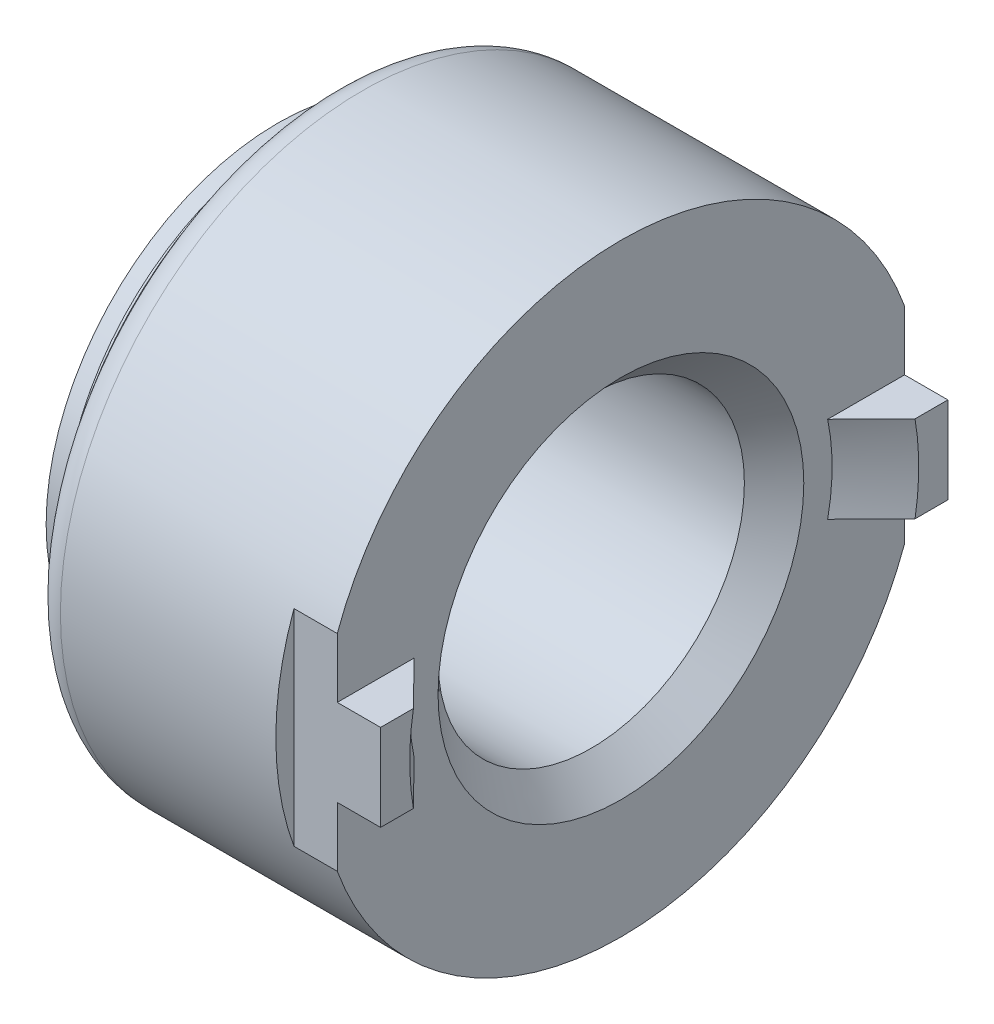
ISO-10303-21;
HEADER;
FILE_DESCRIPTION(('STEP AP214'),'2;1');
FILE_NAME('part.step','',(''),(''),'','','');
FILE_SCHEMA(('AUTOMOTIVE_DESIGN { 1 0 10303 214 1 1 1 1 }'));
ENDSEC;
DATA;
#1=APPLICATION_CONTEXT('core data for automotive mechanical design processes');
#2=APPLICATION_PROTOCOL_DEFINITION('international standard','automotive_design',2000,#1);
#3=PRODUCT_CONTEXT('',#1,'mechanical');
#4=PRODUCT('Part','Part','',(#3));
#5=PRODUCT_RELATED_PRODUCT_CATEGORY('part','',(#4));
#6=PRODUCT_DEFINITION_FORMATION('','',#4);
#7=PRODUCT_DEFINITION_CONTEXT('part definition',#1,'design');
#8=PRODUCT_DEFINITION('design','',#6,#7);
#9=PRODUCT_DEFINITION_SHAPE('','',#8);
#10=(LENGTH_UNIT() NAMED_UNIT(*) SI_UNIT(.MILLI.,.METRE.));
#11=(NAMED_UNIT(*) PLANE_ANGLE_UNIT() SI_UNIT($,.RADIAN.));
#12=(NAMED_UNIT(*) SI_UNIT($,.STERADIAN.) SOLID_ANGLE_UNIT());
#13=UNCERTAINTY_MEASURE_WITH_UNIT(LENGTH_MEASURE(1.E-05),#10,'distance_accuracy_value','');
#14=(GEOMETRIC_REPRESENTATION_CONTEXT(3) GLOBAL_UNCERTAINTY_ASSIGNED_CONTEXT((#13)) GLOBAL_UNIT_ASSIGNED_CONTEXT((#10,
#11,#12)) REPRESENTATION_CONTEXT('',''));
#15=CARTESIAN_POINT('',(0.,0.,0.));
#16=DIRECTION('',(0.,0.,1.));
#17=DIRECTION('',(1.,0.,0.));
#18=AXIS2_PLACEMENT_3D('',#15,#16,#17);
#19=CARTESIAN_POINT('',(9.38000000000008,0.,0.));
#20=DIRECTION('',(1.,0.,0.));
#21=DIRECTION('',(0.,0.,-1.));
#22=AXIS2_PLACEMENT_3D('',#19,#20,#21);
#23=PLANE('',#22);
#24=CARTESIAN_POINT('',(9.38000000000008,0.,0.));
#25=DIRECTION('',(1.,0.,0.));
#26=DIRECTION('',(0.,0.,-1.));
#27=AXIS2_PLACEMENT_3D('',#24,#25,#26);
#28=CIRCLE('',#27,5.00000000005311);
#29=CARTESIAN_POINT('',(9.38000000000008,0.,-5.00000000005311));
#30=VERTEX_POINT('',#29);
#31=EDGE_CURVE('E219',#30,#30,#28,.F.);
#32=ORIENTED_EDGE('',*,*,#31,.T.);
#33=EDGE_LOOP('',(#32));
#34=FACE_BOUND('',#33,.T.);
#35=DIRECTION('',(0.,1.,0.));
#36=VECTOR('',#35,1.);
#37=CARTESIAN_POINT('',(9.38000000000008,-2.81468914802327,-7.75500000000001));
#38=LINE('',#37,#36);
#39=CARTESIAN_POINT('',(9.38000000000008,1.18400000000002,-7.75500000000001));
#40=VERTEX_POINT('',#39);
#41=CARTESIAN_POINT('',(9.38000000000008,2.81468914802327,-7.75500000000001));
#42=VERTEX_POINT('',#41);
#43=EDGE_CURVE('E80',#40,#42,#38,.T.);
#44=ORIENTED_EDGE('',*,*,#43,.T.);
#45=CARTESIAN_POINT('',(9.38000000000008,0.,0.));
#46=DIRECTION('',(1.,0.,0.));
#47=DIRECTION('',(0.,0.,-1.));
#48=AXIS2_PLACEMENT_3D('',#45,#46,#47);
#49=CIRCLE('',#48,8.25);
#50=CARTESIAN_POINT('',(9.38000000000008,2.81468914802319,7.75500000000001));
#51=VERTEX_POINT('',#50);
#52=EDGE_CURVE('E150',#42,#51,#49,.T.);
#53=ORIENTED_EDGE('',*,*,#52,.T.);
#54=DIRECTION('',(0.,-1.,0.));
#55=VECTOR('',#54,1.);
#56=CARTESIAN_POINT('',(9.38000000000008,2.81468914802319,7.75500000000001));
#57=LINE('',#56,#55);
#58=CARTESIAN_POINT('',(9.38000000000008,1.18399999999999,7.75500000000001));
#59=VERTEX_POINT('',#58);
#60=EDGE_CURVE('E257',#51,#59,#57,.T.);
#61=ORIENTED_EDGE('',*,*,#60,.T.);
#62=DIRECTION('',(0.,0.,1.));
#63=VECTOR('',#62,1.);
#64=CARTESIAN_POINT('',(9.38000000000008,1.18399999999999,7.75500000000001));
#65=LINE('',#64,#63);
#66=CARTESIAN_POINT('',(9.38000000000008,1.18399999999991,5.65232421218825));
#67=VERTEX_POINT('',#66);
#68=EDGE_CURVE('E126',#67,#59,#65,.T.);
#69=ORIENTED_EDGE('',*,*,#68,.F.);
#70=CARTESIAN_POINT('',(9.38000000000008,0.,0.));
#71=DIRECTION('',(-1.,0.,0.));
#72=DIRECTION('',(0.,0.,-1.));
#73=AXIS2_PLACEMENT_3D('',#70,#71,#72);
#74=CIRCLE('',#73,5.77499999997313);
#75=CARTESIAN_POINT('',(9.38000000000008,-1.18400000000007,5.65232421218825));
#76=VERTEX_POINT('',#75);
#77=EDGE_CURVE('E130',#76,#67,#74,.T.);
#78=ORIENTED_EDGE('',*,*,#77,.F.);
#79=DIRECTION('',(0.,0.,-1.));
#80=VECTOR('',#79,1.);
#81=CARTESIAN_POINT('',(9.38000000000008,-1.18400000000007,5.65232421218825));
#82=LINE('',#81,#80);
#83=CARTESIAN_POINT('',(9.38000000000008,-1.18399999999999,7.75500000000001));
#84=VERTEX_POINT('',#83);
#85=EDGE_CURVE('E116',#84,#76,#82,.T.);
#86=ORIENTED_EDGE('',*,*,#85,.F.);
#87=CARTESIAN_POINT('',(9.38000000000008,-2.8146891480233,7.75500000000001));
#88=VERTEX_POINT('',#87);
#89=EDGE_CURVE('E51',#84,#88,#57,.T.);
#90=ORIENTED_EDGE('',*,*,#89,.T.);
#91=CARTESIAN_POINT('',(9.38000000000008,-2.81468914802327,-7.75500000000001));
#92=VERTEX_POINT('',#91);
#93=EDGE_CURVE('E147',#88,#92,#49,.T.);
#94=ORIENTED_EDGE('',*,*,#93,.T.);
#95=CARTESIAN_POINT('',(9.38000000000008,-1.18399999999999,-7.75500000000001));
#96=VERTEX_POINT('',#95);
#97=EDGE_CURVE('E292',#92,#96,#38,.T.);
#98=ORIENTED_EDGE('',*,*,#97,.T.);
#99=DIRECTION('',(0.,0.,-1.));
#100=VECTOR('',#99,1.);
#101=CARTESIAN_POINT('',(9.38000000000008,-1.18399999999999,-7.75500000000001));
#102=LINE('',#101,#100);
#103=CARTESIAN_POINT('',(9.38000000000008,-1.18400000000007,-5.65232421218825));
#104=VERTEX_POINT('',#103);
#105=EDGE_CURVE('E298',#104,#96,#102,.T.);
#106=ORIENTED_EDGE('',*,*,#105,.F.);
#107=CARTESIAN_POINT('',(9.38000000000008,0.,0.));
#108=DIRECTION('',(-1.,0.,0.));
#109=DIRECTION('',(0.,0.,-1.));
#110=AXIS2_PLACEMENT_3D('',#107,#108,#109);
#111=CIRCLE('',#110,5.77499999997313);
#112=CARTESIAN_POINT('',(9.38000000000008,1.18399999999999,-5.65232421218825));
#113=VERTEX_POINT('',#112);
#114=EDGE_CURVE('E290',#113,#104,#111,.T.);
#115=ORIENTED_EDGE('',*,*,#114,.F.);
#116=DIRECTION('',(0.,0.,1.));
#117=VECTOR('',#116,1.);
#118=CARTESIAN_POINT('',(9.38000000000008,1.18400000000002,-5.65232421218825));
#119=LINE('',#118,#117);
#120=EDGE_CURVE('E286',#40,#113,#119,.T.);
#121=ORIENTED_EDGE('',*,*,#120,.F.);
#122=EDGE_LOOP('',(#44,#53,#61,#69,#78,#86,#90,#94,#98,#106,#115,#121));
#123=FACE_BOUND('',#122,.T.);
#124=ADVANCED_FACE('F34',(#34,#123),#23,.T.);
#125=CARTESIAN_POINT('',(1.48000000000001,0.,0.));
#126=DIRECTION('',(1.,0.,0.));
#127=DIRECTION('',(0.,0.,-1.));
#128=AXIS2_PLACEMENT_3D('',#125,#126,#127);
#129=CYLINDRICAL_SURFACE('',#128,8.25);
#130=CARTESIAN_POINT('',(2.305,0.,0.));
#131=DIRECTION('',(-1.,0.,0.));
#132=DIRECTION('',(0.,0.,1.));
#133=AXIS2_PLACEMENT_3D('',#130,#131,#132);
#134=CIRCLE('',#133,8.25);
#135=CARTESIAN_POINT('',(2.305,0.,8.25));
#136=VERTEX_POINT('',#135);
#137=EDGE_CURVE('E43',#136,#136,#134,.F.);
#138=ORIENTED_EDGE('',*,*,#137,.T.);
#139=EDGE_LOOP('',(#138));
#140=FACE_BOUND('',#139,.T.);
#141=DIRECTION('',(-1.,0.,0.));
#142=VECTOR('',#141,1.);
#143=CARTESIAN_POINT('',(15.0310994505495,-2.81468914802327,-7.75500000000001));
#144=LINE('',#143,#142);
#145=CARTESIAN_POINT('',(8.19500000000009,-2.81468914802327,-7.75500000000001));
#146=VERTEX_POINT('',#145);
#147=EDGE_CURVE('E278',#92,#146,#144,.T.);
#148=ORIENTED_EDGE('',*,*,#147,.F.);
#149=ORIENTED_EDGE('',*,*,#93,.F.);
#150=DIRECTION('',(-1.,0.,0.));
#151=VECTOR('',#150,1.);
#152=CARTESIAN_POINT('',(15.0310994505495,-2.8146891480233,7.75500000000001));
#153=LINE('',#152,#151);
#154=CARTESIAN_POINT('',(8.19500000000001,-2.8146891480233,7.75500000000001));
#155=VERTEX_POINT('',#154);
#156=EDGE_CURVE('E138',#88,#155,#153,.T.);
#157=ORIENTED_EDGE('',*,*,#156,.T.);
#158=CARTESIAN_POINT('',(8.19500000000001,0.,0.));
#159=DIRECTION('',(-1.,0.,0.));
#160=DIRECTION('',(0.,0.,1.));
#161=AXIS2_PLACEMENT_3D('',#158,#159,#160);
#162=CIRCLE('',#161,8.25);
#163=CARTESIAN_POINT('',(8.19500000000001,2.81468914802319,7.75500000000001));
#164=VERTEX_POINT('',#163);
#165=EDGE_CURVE('E188',#155,#164,#162,.T.);
#166=ORIENTED_EDGE('',*,*,#165,.T.);
#167=DIRECTION('',(-1.,0.,0.));
#168=VECTOR('',#167,1.);
#169=CARTESIAN_POINT('',(15.0310994505495,2.81468914802319,7.75500000000001));
#170=LINE('',#169,#168);
#171=EDGE_CURVE('E135',#51,#164,#170,.T.);
#172=ORIENTED_EDGE('',*,*,#171,.F.);
#173=ORIENTED_EDGE('',*,*,#52,.F.);
#174=DIRECTION('',(-1.,0.,0.));
#175=VECTOR('',#174,1.);
#176=CARTESIAN_POINT('',(15.0310994505495,2.81468914802327,-7.75500000000001));
#177=LINE('',#176,#175);
#178=CARTESIAN_POINT('',(8.19500000000009,2.81468914802327,-7.75500000000001));
#179=VERTEX_POINT('',#178);
#180=EDGE_CURVE('E287',#42,#179,#177,.T.);
#181=ORIENTED_EDGE('',*,*,#180,.T.);
#182=CARTESIAN_POINT('',(8.19500000000001,0.,0.));
#183=DIRECTION('',(-1.,0.,0.));
#184=DIRECTION('',(0.,0.,1.));
#185=AXIS2_PLACEMENT_3D('',#182,#183,#184);
#186=CIRCLE('',#185,8.25);
#187=EDGE_CURVE('E281',#179,#146,#186,.T.);
#188=ORIENTED_EDGE('',*,*,#187,.T.);
#189=EDGE_LOOP('',(#148,#149,#157,#166,#172,#173,#181,#188));
#190=FACE_BOUND('',#189,.T.);
#191=ADVANCED_FACE('F210',(#140,#190),#129,.T.);
#192=CARTESIAN_POINT('',(1.48000000000001,8.25000000000001,0.));
#193=DIRECTION('',(-1.,0.,0.));
#194=DIRECTION('',(0.,0.,1.));
#195=AXIS2_PLACEMENT_3D('',#192,#193,#194);
#196=PLANE('',#195);
#197=CARTESIAN_POINT('',(1.48000000000001,0.,0.));
#198=DIRECTION('',(-1.,0.,0.));
#199=DIRECTION('',(0.,0.,1.));
#200=AXIS2_PLACEMENT_3D('',#197,#198,#199);
#201=CIRCLE('',#200,7.425);
#202=CARTESIAN_POINT('',(1.48000000000001,0.,7.425));
#203=VERTEX_POINT('',#202);
#204=EDGE_CURVE('E11',#203,#203,#201,.T.);
#205=ORIENTED_EDGE('',*,*,#204,.T.);
#206=EDGE_LOOP('',(#205));
#207=FACE_BOUND('',#206,.T.);
#208=CARTESIAN_POINT('',(1.48000000000001,0.,0.));
#209=DIRECTION('',(-1.,0.,0.));
#210=DIRECTION('',(0.,0.,1.));
#211=AXIS2_PLACEMENT_3D('',#208,#209,#210);
#212=CIRCLE('',#211,7.2925);
#213=CARTESIAN_POINT('',(1.48000000000001,0.,-7.2925));
#214=VERTEX_POINT('',#213);
#215=EDGE_CURVE('E312',#214,#214,#212,.T.);
#216=ORIENTED_EDGE('',*,*,#215,.F.);
#217=EDGE_LOOP('',(#216));
#218=FACE_BOUND('',#217,.T.);
#219=ADVANCED_FACE('F215',(#207,#218),#196,.T.);
#220=CARTESIAN_POINT('',(9.38000000000008,0.,0.));
#221=DIRECTION('',(1.,0.,0.));
#222=DIRECTION('',(0.,0.,-1.));
#223=AXIS2_PLACEMENT_3D('',#220,#221,#222);
#224=CONICAL_SURFACE('',#223,5.77499999997313,0.785398163373447);
#225=ORIENTED_EDGE('',*,*,#77,.T.);
#226=CARTESIAN_POINT('',(10.5640000000001,1.18399999999991,6.85753782336163));
#227=CARTESIAN_POINT('',(10.4651794670113,1.18399999999996,6.75725460929455));
#228=CARTESIAN_POINT('',(10.3663902061018,1.18399999999998,6.65694056545883));
#229=CARTESIAN_POINT('',(10.1688846489795,1.184,6.45624081663868));
#230=CARTESIAN_POINT('',(10.070168352715,1.18399999999999,6.35585511170503));
#231=CARTESIAN_POINT('',(9.87281898757948,1.18399999999999,6.15500187890615));
#232=CARTESIAN_POINT('',(9.77418591872361,1.184,6.05453435102608));
#233=CARTESIAN_POINT('',(9.57701675832027,1.18399999999998,5.85350404507877));
#234=CARTESIAN_POINT('',(9.4784806668416,1.18399999999996,5.75294126694403));
#235=CARTESIAN_POINT('',(9.38000000000008,1.18399999999991,5.65232421218825));
#236=B_SPLINE_CURVE_WITH_KNOTS('',3,(#226,#227,#228,#229,#230,#231,#232,#233,#234,#235),
.UNSPECIFIED.,.F.,.F.,(4,2,2,2,4),(0.,0.422374233235577,0.844748167452747,1.26712217825608,
1.68949648855133),.UNSPECIFIED.);
#237=CARTESIAN_POINT('',(10.5640000000001,1.18399999999991,6.85753782336163));
#238=VERTEX_POINT('',#237);
#239=EDGE_CURVE('E110',#238,#67,#236,.T.);
#240=ORIENTED_EDGE('',*,*,#239,.F.);
#241=CARTESIAN_POINT('',(10.5640000000001,0.,0.));
#242=DIRECTION('',(1.,0.,0.));
#243=DIRECTION('',(0.,0.,-1.));
#244=AXIS2_PLACEMENT_3D('',#241,#242,#243);
#245=CIRCLE('',#244,6.9589999999163);
#246=CARTESIAN_POINT('',(10.5640000000001,-1.18400000000007,6.85753782336163));
#247=VERTEX_POINT('',#246);
#248=EDGE_CURVE('E125',#247,#238,#245,.F.);
#249=ORIENTED_EDGE('',*,*,#248,.F.);
#250=CARTESIAN_POINT('',(33.2513253427863,-1.1840000000001,29.6226729087837));
#251=CARTESIAN_POINT('',(32.2550215105378,-1.18400000000008,28.6255677454555));
#252=CARTESIAN_POINT('',(31.2587523156161,-1.18400000000008,27.6284279645992));
#253=CARTESIAN_POINT('',(29.2663262835958,-1.18400000000007,25.6340370724286));
#254=CARTESIAN_POINT('',(28.2701694464457,-1.18400000000007,24.6367859611656));
#255=CARTESIAN_POINT('',(26.2780122912579,-1.18400000000007,22.6421313928196));
#256=CARTESIAN_POINT('',(25.2820119729109,-1.18400000000007,21.6447279360453));
#257=CARTESIAN_POINT('',(23.2902438655782,-1.18400000000007,19.6496879567358));
#258=CARTESIAN_POINT('',(22.2944760766994,-1.18400000000007,18.6520514340939));
#259=CARTESIAN_POINT('',(20.3033024523513,-1.18400000000007,16.656409947521));
#260=CARTESIAN_POINT('',(19.3078966182077,-1.18400000000007,15.6584049822671));
#261=CARTESIAN_POINT('',(17.815271904452,-1.18400000000007,14.1609162614695));
#262=CARTESIAN_POINT('',(17.3178113101418,-1.18400000000007,13.661673447801));
#263=CARTESIAN_POINT('',(16.3231156478769,-1.18400000000007,12.6629628425552));
#264=CARTESIAN_POINT('',(15.8258805799967,-1.18400000000007,12.1634950509036));
#265=CARTESIAN_POINT('',(14.8317309044927,-1.18400000000007,11.1642365211599));
#266=CARTESIAN_POINT('',(14.334816298198,-1.18400000000007,10.6644457817454));
#267=CARTESIAN_POINT('',(13.3414690560179,-1.18400000000007,9.664386259989));
#268=CARTESIAN_POINT('',(12.8450364196931,-1.18400000000007,9.16411747808383));
#269=CARTESIAN_POINT('',(12.1009716074972,-1.18400000000007,8.41313317496518));
#270=CARTESIAN_POINT('',(11.8530467867255,-1.18400000000007,8.16270763798321));
#271=CARTESIAN_POINT('',(11.3574571137144,-1.18400000000007,7.66159964731243));
#272=CARTESIAN_POINT('',(11.1097922613629,-1.18400000000007,7.41091719373452));
#273=CARTESIAN_POINT('',(10.6148051667901,-1.18400000000007,6.90921250222974));
#274=CARTESIAN_POINT('',(10.3674829256599,-1.18400000000007,6.65819026322584));
#275=CARTESIAN_POINT('',(9.87333278462519,-1.18400000000007,6.1556590441553));
#276=CARTESIAN_POINT('',(9.62650488546302,-1.18400000000007,5.90415006335892));
#277=CARTESIAN_POINT('',(9.38000000000008,-1.18400000000007,5.65232421218831));
#278=B_SPLINE_CURVE_WITH_KNOTS('',3,(#250,#251,#252,#253,#254,#255,#256,#257,#258,#259,#260,
#261,#262,#263,#264,#265,#266,#267,#268,#269,#270,#271,#272,#273,#274,#275,#276,#277),
.UNSPECIFIED.,.F.,.F.,(4,2,2,2,2,2,2,2,2,2,2,2,2,4),(0.,4.2286594043485,8.45731686656562,
12.6859658663707,16.9146168038646,21.1432830744634,23.2576136240855,25.3719448724965,
27.4862848339641,29.6006228659507,30.6577967808126,31.7149702395227,32.7721470570357,
33.8293254607259),.UNSPECIFIED.);
#279=EDGE_CURVE('E120',#247,#76,#278,.T.);
#280=ORIENTED_EDGE('',*,*,#279,.T.);
#281=EDGE_LOOP('',(#225,#240,#249,#280));
#282=FACE_BOUND('',#281,.T.);
#283=ADVANCED_FACE('F129',(#282),#224,.F.);
#284=CARTESIAN_POINT('',(10.5640000000001,1.18399999999999,7.75500000000001));
#285=DIRECTION('',(0.,-1.,0.));
#286=DIRECTION('',(0.,0.,-1.));
#287=AXIS2_PLACEMENT_3D('',#284,#285,#286);
#288=PLANE('',#287);
#289=ORIENTED_EDGE('',*,*,#68,.T.);
#290=DIRECTION('',(-1.,0.,0.));
#291=VECTOR('',#290,1.);
#292=CARTESIAN_POINT('',(10.5640000000001,1.18399999999999,7.75500000000001));
#293=LINE('',#292,#291);
#294=CARTESIAN_POINT('',(10.5640000000001,1.18399999999999,7.75500000000001));
#295=VERTEX_POINT('',#294);
#296=EDGE_CURVE('E144',#295,#59,#293,.T.);
#297=ORIENTED_EDGE('',*,*,#296,.F.);
#298=DIRECTION('',(0.,0.,1.));
#299=VECTOR('',#298,1.);
#300=CARTESIAN_POINT('',(10.5640000000001,1.18399999999999,7.75500000000001));
#301=LINE('',#300,#299);
#302=EDGE_CURVE('E261',#238,#295,#301,.T.);
#303=ORIENTED_EDGE('',*,*,#302,.F.);
#304=ORIENTED_EDGE('',*,*,#239,.T.);
#305=EDGE_LOOP('',(#289,#297,#303,#304));
#306=FACE_BOUND('',#305,.T.);
#307=ADVANCED_FACE('F171',(#306),#288,.F.);
#308=CARTESIAN_POINT('',(10.5640000000001,-1.18399999999999,7.75500000000001));
#309=DIRECTION('',(0.,0.,-1.));
#310=DIRECTION('',(0.,1.,0.));
#311=AXIS2_PLACEMENT_3D('',#308,#309,#310);
#312=PLANE('',#311);
#313=ORIENTED_EDGE('',*,*,#296,.T.);
#314=ORIENTED_EDGE('',*,*,#60,.F.);
#315=ORIENTED_EDGE('',*,*,#171,.T.);
#316=DIRECTION('',(0.,-1.,0.));
#317=VECTOR('',#316,1.);
#318=CARTESIAN_POINT('',(8.19500000000001,2.81468914802319,7.75500000000001));
#319=LINE('',#318,#317);
#320=EDGE_CURVE('E252',#164,#155,#319,.T.);
#321=ORIENTED_EDGE('',*,*,#320,.T.);
#322=ORIENTED_EDGE('',*,*,#156,.F.);
#323=ORIENTED_EDGE('',*,*,#89,.F.);
#324=DIRECTION('',(-1.,0.,0.));
#325=VECTOR('',#324,1.);
#326=CARTESIAN_POINT('',(10.5640000000001,-1.18399999999999,7.75500000000001));
#327=LINE('',#326,#325);
#328=CARTESIAN_POINT('',(10.5640000000001,-1.18399999999999,7.75500000000001));
#329=VERTEX_POINT('',#328);
#330=EDGE_CURVE('E122',#329,#84,#327,.T.);
#331=ORIENTED_EDGE('',*,*,#330,.F.);
#332=DIRECTION('',(0.,-1.,0.));
#333=VECTOR('',#332,1.);
#334=CARTESIAN_POINT('',(10.5640000000001,-1.18399999999999,7.75500000000001));
#335=LINE('',#334,#333);
#336=EDGE_CURVE('E262',#295,#329,#335,.T.);
#337=ORIENTED_EDGE('',*,*,#336,.F.);
#338=EDGE_LOOP('',(#313,#314,#315,#321,#322,#323,#331,#337));
#339=FACE_BOUND('',#338,.T.);
#340=ADVANCED_FACE('F167',(#339),#312,.F.);
#341=CARTESIAN_POINT('',(10.5640000000001,-1.18400000000007,5.65232421218825));
#342=DIRECTION('',(0.,1.,0.));
#343=DIRECTION('',(0.,0.,1.));
#344=AXIS2_PLACEMENT_3D('',#341,#342,#343);
#345=PLANE('',#344);
#346=ORIENTED_EDGE('',*,*,#85,.T.);
#347=ORIENTED_EDGE('',*,*,#279,.F.);
#348=DIRECTION('',(0.,0.,-1.));
#349=VECTOR('',#348,1.);
#350=CARTESIAN_POINT('',(10.5640000000001,-1.18400000000007,5.65232421218825));
#351=LINE('',#350,#349);
#352=EDGE_CURVE('E133',#329,#247,#351,.T.);
#353=ORIENTED_EDGE('',*,*,#352,.F.);
#354=ORIENTED_EDGE('',*,*,#330,.T.);
#355=EDGE_LOOP('',(#346,#347,#353,#354));
#356=FACE_BOUND('',#355,.T.);
#357=ADVANCED_FACE('F118',(#356),#345,.F.);
#358=CARTESIAN_POINT('',(10.5640000000001,0.,0.));
#359=DIRECTION('',(1.,0.,0.));
#360=DIRECTION('',(0.,0.,-1.));
#361=AXIS2_PLACEMENT_3D('',#358,#359,#360);
#362=PLANE('',#361);
#363=ORIENTED_EDGE('',*,*,#248,.T.);
#364=ORIENTED_EDGE('',*,*,#302,.T.);
#365=ORIENTED_EDGE('',*,*,#336,.T.);
#366=ORIENTED_EDGE('',*,*,#352,.T.);
#367=EDGE_LOOP('',(#363,#364,#365,#366));
#368=FACE_BOUND('',#367,.T.);
#369=ADVANCED_FACE('F166',(#368),#362,.T.);
#370=CARTESIAN_POINT('',(8.19500000000001,0.,0.));
#371=DIRECTION('',(-1.,0.,0.));
#372=DIRECTION('',(0.,0.,1.));
#373=AXIS2_PLACEMENT_3D('',#370,#371,#372);
#374=PLANE('',#373);
#375=ORIENTED_EDGE('',*,*,#165,.F.);
#376=ORIENTED_EDGE('',*,*,#320,.F.);
#377=EDGE_LOOP('',(#375,#376));
#378=FACE_BOUND('',#377,.T.);
#379=ADVANCED_FACE('F198',(#378),#374,.F.);
#380=CARTESIAN_POINT('',(10.5640000000001,1.18400000000002,-5.65232421218825));
#381=DIRECTION('',(0.,-1.,0.));
#382=DIRECTION('',(0.,0.,-1.));
#383=AXIS2_PLACEMENT_3D('',#380,#381,#382);
#384=PLANE('',#383);
#385=ORIENTED_EDGE('',*,*,#120,.T.);
#386=CARTESIAN_POINT('',(33.2513253427863,1.18399999999991,-29.6226729087837));
#387=CARTESIAN_POINT('',(32.2550215105377,1.18399999999998,-28.6255677454555));
#388=CARTESIAN_POINT('',(31.2587523156161,1.18400000000001,-27.6284279645992));
#389=CARTESIAN_POINT('',(29.2663262835957,1.18400000000003,-25.6340370724285));
#390=CARTESIAN_POINT('',(28.2701694464457,1.18400000000002,-24.6367859611656));
#391=CARTESIAN_POINT('',(26.2780122912578,1.18400000000002,-22.6421313928196));
#392=CARTESIAN_POINT('',(25.2820119729109,1.18400000000002,-21.6447279360453));
#393=CARTESIAN_POINT('',(23.2902438655782,1.18400000000002,-19.6496879567358));
#394=CARTESIAN_POINT('',(22.2944760766993,1.18400000000002,-18.6520514340939));
#395=CARTESIAN_POINT('',(20.3033024523513,1.18400000000002,-16.656409947521));
#396=CARTESIAN_POINT('',(19.3078966182077,1.18400000000002,-15.658404982267));
#397=CARTESIAN_POINT('',(17.8152719044519,1.18400000000002,-14.1609162614695));
#398=CARTESIAN_POINT('',(17.3178113101418,1.18400000000002,-13.661673447801));
#399=CARTESIAN_POINT('',(16.3231156478768,1.18400000000002,-12.6629628425552));
#400=CARTESIAN_POINT('',(15.8258805799966,1.18400000000002,-12.1634950509036));
#401=CARTESIAN_POINT('',(14.8317309044927,1.18400000000002,-11.1642365211599));
#402=CARTESIAN_POINT('',(14.334816298198,1.18400000000002,-10.6644457817453));
#403=CARTESIAN_POINT('',(13.3414690560179,1.18400000000002,-9.66438625998898));
#404=CARTESIAN_POINT('',(12.8450364196931,1.18400000000002,-9.1641174780838));
#405=CARTESIAN_POINT('',(12.1009716074971,1.18400000000002,-8.41313317496516));
#406=CARTESIAN_POINT('',(11.8530467867254,1.18400000000002,-8.16270763798319));
#407=CARTESIAN_POINT('',(11.3574571137144,1.18400000000002,-7.66159964731241));
#408=CARTESIAN_POINT('',(11.1097922613629,1.18400000000002,-7.4109171937345));
#409=CARTESIAN_POINT('',(10.6148051667901,1.18400000000002,-6.90921250222972));
#410=CARTESIAN_POINT('',(10.3674829256598,1.18400000000002,-6.65819026322583));
#411=CARTESIAN_POINT('',(9.87333278462515,1.18400000000002,-6.15565904415528));
#412=CARTESIAN_POINT('',(9.626504885463,1.18400000000002,-5.90415006335889));
#413=CARTESIAN_POINT('',(9.38000000000008,1.18400000000002,-5.65232421218825));
#414=B_SPLINE_CURVE_WITH_KNOTS('',3,(#386,#387,#388,#389,#390,#391,#392,#393,#394,#395,#396,
#397,#398,#399,#400,#401,#402,#403,#404,#405,#406,#407,#408,#409,#410,#411,#412,#413),
.UNSPECIFIED.,.F.,.F.,(4,2,2,2,2,2,2,2,2,2,2,2,2,4),(0.,4.22865940434849,8.45731686656561,
12.6859658663706,16.9146168038646,21.1432830744634,23.2576136240855,25.3719448724965,
27.4862848339641,29.6006228659507,30.6577967808126,31.7149702395227,32.7721470570357,
33.8293254607259),.UNSPECIFIED.);
#415=CARTESIAN_POINT('',(10.5640000000001,1.18399999999994,-6.85753782336157));
#416=VERTEX_POINT('',#415);
#417=EDGE_CURVE('E181',#416,#113,#414,.T.);
#418=ORIENTED_EDGE('',*,*,#417,.F.);
#419=DIRECTION('',(0.,0.,1.));
#420=VECTOR('',#419,1.);
#421=CARTESIAN_POINT('',(10.5640000000001,1.18400000000002,-5.65232421218825));
#422=LINE('',#421,#420);
#423=CARTESIAN_POINT('',(10.5640000000001,1.18400000000002,-7.75500000000001));
#424=VERTEX_POINT('',#423);
#425=EDGE_CURVE('E296',#424,#416,#422,.T.);
#426=ORIENTED_EDGE('',*,*,#425,.F.);
#427=DIRECTION('',(-1.,0.,0.));
#428=VECTOR('',#427,1.);
#429=CARTESIAN_POINT('',(10.5640000000001,1.18400000000002,-7.75500000000001));
#430=LINE('',#429,#428);
#431=EDGE_CURVE('E242',#424,#40,#430,.T.);
#432=ORIENTED_EDGE('',*,*,#431,.T.);
#433=EDGE_LOOP('',(#385,#418,#426,#432));
#434=FACE_BOUND('',#433,.T.);
#435=ADVANCED_FACE('F194',(#434),#384,.F.);
#436=CARTESIAN_POINT('',(9.38000000000008,0.,0.));
#437=DIRECTION('',(1.,0.,0.));
#438=DIRECTION('',(0.,0.,-1.));
#439=AXIS2_PLACEMENT_3D('',#436,#437,#438);
#440=CONICAL_SURFACE('',#439,5.77499999997313,0.785398163373447);
#441=ORIENTED_EDGE('',*,*,#114,.T.);
#442=CARTESIAN_POINT('',(10.5640000000001,-1.18399999999999,-6.85753782336163));
#443=CARTESIAN_POINT('',(10.4651794670113,-1.18399999999999,-6.75725460929455));
#444=CARTESIAN_POINT('',(10.3663902061018,-1.18399999999999,-6.65694056545882));
#445=CARTESIAN_POINT('',(10.1688846489795,-1.18399999999999,-6.45624081663867));
#446=CARTESIAN_POINT('',(10.070168352715,-1.18399999999999,-6.35585511170502));
#447=CARTESIAN_POINT('',(9.87281898757947,-1.18399999999999,-6.15500187890615));
#448=CARTESIAN_POINT('',(9.7741859187236,-1.18399999999998,-6.05453435102608));
#449=CARTESIAN_POINT('',(9.57701675832026,-1.184,-5.85350404507877));
#450=CARTESIAN_POINT('',(9.47848066684159,-1.18400000000002,-5.75294126694404));
#451=CARTESIAN_POINT('',(9.38000000000008,-1.18400000000007,-5.65232421218825));
#452=B_SPLINE_CURVE_WITH_KNOTS('',3,(#442,#443,#444,#445,#446,#447,#448,#449,#450,#451),
.UNSPECIFIED.,.F.,.F.,(4,2,2,2,4),(0.,0.422374233235571,0.844748167452737,1.26712217825606,
1.68949648855131),.UNSPECIFIED.);
#453=CARTESIAN_POINT('',(10.5640000000001,-1.18399999999999,-6.85753782336163));
#454=VERTEX_POINT('',#453);
#455=EDGE_CURVE('E189',#454,#104,#452,.T.);
#456=ORIENTED_EDGE('',*,*,#455,.F.);
#457=CARTESIAN_POINT('',(10.5640000000001,0.,0.));
#458=DIRECTION('',(1.,0.,0.));
#459=DIRECTION('',(0.,0.,-1.));
#460=AXIS2_PLACEMENT_3D('',#457,#458,#459);
#461=CIRCLE('',#460,6.9589999999163);
#462=EDGE_CURVE('E70',#416,#454,#461,.F.);
#463=ORIENTED_EDGE('',*,*,#462,.F.);
#464=ORIENTED_EDGE('',*,*,#417,.T.);
#465=EDGE_LOOP('',(#441,#456,#463,#464));
#466=FACE_BOUND('',#465,.T.);
#467=ADVANCED_FACE('F191',(#466),#440,.F.);
#468=CARTESIAN_POINT('',(10.5640000000001,-1.18399999999999,-7.75500000000001));
#469=DIRECTION('',(0.,1.,0.));
#470=DIRECTION('',(0.,0.,1.));
#471=AXIS2_PLACEMENT_3D('',#468,#469,#470);
#472=PLANE('',#471);
#473=ORIENTED_EDGE('',*,*,#105,.T.);
#474=DIRECTION('',(-1.,0.,0.));
#475=VECTOR('',#474,1.);
#476=CARTESIAN_POINT('',(10.5640000000001,-1.18399999999999,-7.75500000000001));
#477=LINE('',#476,#475);
#478=CARTESIAN_POINT('',(10.5640000000001,-1.18399999999999,-7.75500000000001));
#479=VERTEX_POINT('',#478);
#480=EDGE_CURVE('E236',#479,#96,#477,.T.);
#481=ORIENTED_EDGE('',*,*,#480,.F.);
#482=DIRECTION('',(0.,0.,-1.));
#483=VECTOR('',#482,1.);
#484=CARTESIAN_POINT('',(10.5640000000001,-1.18399999999999,-7.75500000000001));
#485=LINE('',#484,#483);
#486=EDGE_CURVE('E299',#454,#479,#485,.T.);
#487=ORIENTED_EDGE('',*,*,#486,.F.);
#488=ORIENTED_EDGE('',*,*,#455,.T.);
#489=EDGE_LOOP('',(#473,#481,#487,#488));
#490=FACE_BOUND('',#489,.T.);
#491=ADVANCED_FACE('F200',(#490),#472,.F.);
#492=CARTESIAN_POINT('',(10.5640000000001,1.18400000000002,-7.75500000000001));
#493=DIRECTION('',(0.,0.,1.));
#494=DIRECTION('',(1.,0.,0.));
#495=AXIS2_PLACEMENT_3D('',#492,#493,#494);
#496=PLANE('',#495);
#497=ORIENTED_EDGE('',*,*,#480,.T.);
#498=ORIENTED_EDGE('',*,*,#97,.F.);
#499=ORIENTED_EDGE('',*,*,#147,.T.);
#500=DIRECTION('',(0.,1.,0.));
#501=VECTOR('',#500,1.);
#502=CARTESIAN_POINT('',(8.19500000000009,-2.81468914802327,-7.75500000000001));
#503=LINE('',#502,#501);
#504=EDGE_CURVE('E307',#146,#179,#503,.T.);
#505=ORIENTED_EDGE('',*,*,#504,.T.);
#506=ORIENTED_EDGE('',*,*,#180,.F.);
#507=ORIENTED_EDGE('',*,*,#43,.F.);
#508=ORIENTED_EDGE('',*,*,#431,.F.);
#509=DIRECTION('',(0.,1.,0.));
#510=VECTOR('',#509,1.);
#511=CARTESIAN_POINT('',(10.5640000000001,1.18400000000002,-7.75500000000001));
#512=LINE('',#511,#510);
#513=EDGE_CURVE('E248',#479,#424,#512,.T.);
#514=ORIENTED_EDGE('',*,*,#513,.F.);
#515=EDGE_LOOP('',(#497,#498,#499,#505,#506,#507,#508,#514));
#516=FACE_BOUND('',#515,.T.);
#517=ADVANCED_FACE('F391',(#516),#496,.F.);
#518=CARTESIAN_POINT('',(10.5640000000001,0.,0.));
#519=DIRECTION('',(1.,0.,0.));
#520=DIRECTION('',(0.,0.,-1.));
#521=AXIS2_PLACEMENT_3D('',#518,#519,#520);
#522=PLANE('',#521);
#523=ORIENTED_EDGE('',*,*,#425,.T.);
#524=ORIENTED_EDGE('',*,*,#462,.T.);
#525=ORIENTED_EDGE('',*,*,#486,.T.);
#526=ORIENTED_EDGE('',*,*,#513,.T.);
#527=EDGE_LOOP('',(#523,#524,#525,#526));
#528=FACE_BOUND('',#527,.T.);
#529=ADVANCED_FACE('F388',(#528),#522,.T.);
#530=CARTESIAN_POINT('',(8.19500000000001,0.,0.));
#531=DIRECTION('',(-1.,0.,0.));
#532=DIRECTION('',(0.,0.,1.));
#533=AXIS2_PLACEMENT_3D('',#530,#531,#532);
#534=PLANE('',#533);
#535=ORIENTED_EDGE('',*,*,#187,.F.);
#536=ORIENTED_EDGE('',*,*,#504,.F.);
#537=EDGE_LOOP('',(#535,#536));
#538=FACE_BOUND('',#537,.T.);
#539=ADVANCED_FACE('F350',(#538),#534,.F.);
#540=CARTESIAN_POINT('',(1.18399999999999,0.,0.));
#541=DIRECTION('',(1.,0.,0.));
#542=DIRECTION('',(0.,0.,-1.));
#543=AXIS2_PLACEMENT_3D('',#540,#541,#542);
#544=CYLINDRICAL_SURFACE('',#543,7.2925);
#545=CARTESIAN_POINT('',(1.18399999999999,0.,0.));
#546=DIRECTION('',(-1.,0.,0.));
#547=DIRECTION('',(0.,0.,1.));
#548=AXIS2_PLACEMENT_3D('',#545,#546,#547);
#549=CIRCLE('',#548,7.2925);
#550=CARTESIAN_POINT('',(1.18399999999999,0.,-7.2925));
#551=VERTEX_POINT('',#550);
#552=EDGE_CURVE('E310',#551,#551,#549,.T.);
#553=CARTESIAN_POINT('',(1.18399999999999,0.,-7.2925));
#554=CARTESIAN_POINT('',(1.18708333333332,0.,-7.2925));
#555=CARTESIAN_POINT('',(1.19016666666666,0.,-7.2925));
#556=CARTESIAN_POINT('',(1.19633333333332,0.,-7.2925));
#557=CARTESIAN_POINT('',(1.19941666666666,0.,-7.2925));
#558=CARTESIAN_POINT('',(1.20558333333333,0.,-7.2925));
#559=CARTESIAN_POINT('',(1.20866666666666,0.,-7.2925));
#560=CARTESIAN_POINT('',(1.21483333333333,0.,-7.2925));
#561=CARTESIAN_POINT('',(1.21791666666666,0.,-7.2925));
#562=CARTESIAN_POINT('',(1.22408333333333,0.,-7.2925));
#563=CARTESIAN_POINT('',(1.22716666666666,0.,-7.2925));
#564=CARTESIAN_POINT('',(1.23333333333333,0.,-7.2925));
#565=CARTESIAN_POINT('',(1.23641666666666,0.,-7.2925));
#566=CARTESIAN_POINT('',(1.24258333333333,0.,-7.2925));
#567=CARTESIAN_POINT('',(1.24566666666666,0.,-7.2925));
#568=CARTESIAN_POINT('',(1.25183333333333,0.,-7.2925));
#569=CARTESIAN_POINT('',(1.25491666666666,0.,-7.2925));
#570=CARTESIAN_POINT('',(1.26108333333333,0.,-7.2925));
#571=CARTESIAN_POINT('',(1.26416666666666,0.,-7.2925));
#572=CARTESIAN_POINT('',(1.27033333333333,0.,-7.2925));
#573=CARTESIAN_POINT('',(1.27341666666666,0.,-7.2925));
#574=CARTESIAN_POINT('',(1.27958333333333,0.,-7.2925));
#575=CARTESIAN_POINT('',(1.28266666666666,0.,-7.2925));
#576=CARTESIAN_POINT('',(1.28883333333333,0.,-7.2925));
#577=CARTESIAN_POINT('',(1.29191666666666,0.,-7.2925));
#578=CARTESIAN_POINT('',(1.29808333333333,0.,-7.2925));
#579=CARTESIAN_POINT('',(1.30116666666666,0.,-7.2925));
#580=CARTESIAN_POINT('',(1.30733333333333,0.,-7.2925));
#581=CARTESIAN_POINT('',(1.31041666666667,0.,-7.2925));
#582=CARTESIAN_POINT('',(1.31658333333333,0.,-7.2925));
#583=CARTESIAN_POINT('',(1.31966666666667,0.,-7.2925));
#584=CARTESIAN_POINT('',(1.32583333333333,0.,-7.2925));
#585=CARTESIAN_POINT('',(1.32891666666667,0.,-7.2925));
#586=CARTESIAN_POINT('',(1.33508333333333,0.,-7.2925));
#587=CARTESIAN_POINT('',(1.33816666666667,0.,-7.2925));
#588=CARTESIAN_POINT('',(1.34433333333333,0.,-7.2925));
#589=CARTESIAN_POINT('',(1.34741666666667,0.,-7.2925));
#590=CARTESIAN_POINT('',(1.35358333333333,0.,-7.2925));
#591=CARTESIAN_POINT('',(1.35666666666667,0.,-7.2925));
#592=CARTESIAN_POINT('',(1.36283333333334,0.,-7.2925));
#593=CARTESIAN_POINT('',(1.36591666666667,0.,-7.2925));
#594=CARTESIAN_POINT('',(1.37208333333334,0.,-7.2925));
#595=CARTESIAN_POINT('',(1.37516666666667,0.,-7.2925));
#596=CARTESIAN_POINT('',(1.38133333333334,0.,-7.2925));
#597=CARTESIAN_POINT('',(1.38441666666667,0.,-7.2925));
#598=CARTESIAN_POINT('',(1.39058333333334,0.,-7.2925));
#599=CARTESIAN_POINT('',(1.39366666666667,0.,-7.2925));
#600=CARTESIAN_POINT('',(1.39983333333334,0.,-7.2925));
#601=CARTESIAN_POINT('',(1.40291666666667,0.,-7.2925));
#602=CARTESIAN_POINT('',(1.40908333333334,0.,-7.2925));
#603=CARTESIAN_POINT('',(1.41216666666667,0.,-7.2925));
#604=CARTESIAN_POINT('',(1.41833333333334,0.,-7.2925));
#605=CARTESIAN_POINT('',(1.42141666666667,0.,-7.2925));
#606=CARTESIAN_POINT('',(1.42758333333334,0.,-7.2925));
#607=CARTESIAN_POINT('',(1.43066666666667,0.,-7.2925));
#608=CARTESIAN_POINT('',(1.43683333333334,0.,-7.2925));
#609=CARTESIAN_POINT('',(1.43991666666667,0.,-7.2925));
#610=CARTESIAN_POINT('',(1.44608333333334,0.,-7.2925));
#611=CARTESIAN_POINT('',(1.44916666666667,0.,-7.2925));
#612=CARTESIAN_POINT('',(1.45533333333334,0.,-7.2925));
#613=CARTESIAN_POINT('',(1.45841666666667,0.,-7.2925));
#614=CARTESIAN_POINT('',(1.46458333333334,0.,-7.2925));
#615=CARTESIAN_POINT('',(1.46766666666668,0.,-7.2925));
#616=CARTESIAN_POINT('',(1.47383333333334,0.,-7.2925));
#617=CARTESIAN_POINT('',(1.47691666666668,0.,-7.2925));
#618=CARTESIAN_POINT('',(1.48000000000001,0.,-7.2925));
#619=B_SPLINE_CURVE_WITH_KNOTS('',3,(#553,#554,#555,#556,#557,#558,#559,#560,#561,#562,#563,
#564,#565,#566,#567,#568,#569,#570,#571,#572,#573,#574,#575,#576,#577,#578,#579,#580,#581,#582,
#583,#584,#585,#586,#587,#588,#589,#590,#591,#592,#593,#594,#595,#596,#597,#598,#599,#600,#601,
#602,#603,#604,#605,#606,#607,#608,#609,#610,#611,#612,#613,#614,#615,#616,#617,#618),
.UNSPECIFIED.,.F.,.F.,(4,2,2,2,2,2,2,2,2,2,2,2,2,2,2,2,2,2,2,2,2,2,2,2,2,2,2,2,2,2,2,2,4),(0.,
0.00925000000000079,0.0185000000000014,0.0277500000000019,0.0370000000000025,0.0462500000000031,
0.0555000000000037,0.0647500000000043,0.0740000000000048,0.0832500000000054,0.092500000000006,
0.101750000000007,0.111000000000007,0.120250000000008,0.129500000000008,0.138750000000009,
0.148000000000009,0.15725000000001,0.166500000000011,0.175750000000011,0.185000000000012,
0.194250000000012,0.203500000000013,0.212750000000013,0.222000000000014,0.231250000000015,
0.240500000000015,0.249750000000016,0.259000000000016,0.268250000000017,0.277500000000018,
0.286750000000018,0.296000000000019),.UNSPECIFIED.);
#620=EDGE_CURVE('BSEAM344',#551,#214,#619,.T.);
#621=ORIENTED_EDGE('',*,*,#552,.F.);
#622=ORIENTED_EDGE('',*,*,#215,.T.);
#623=ORIENTED_EDGE('',*,*,#620,.T.);
#624=ORIENTED_EDGE('',*,*,#620,.F.);
#625=EDGE_LOOP('',(#621,#623,#622,#624));
#626=FACE_BOUND('',#625,.T.);
#627=ADVANCED_FACE('F344',(#626),#544,.T.);
#628=CARTESIAN_POINT('',(1.18399999999999,0.,0.));
#629=DIRECTION('',(-1.,0.,0.));
#630=DIRECTION('',(0.,0.,1.));
#631=AXIS2_PLACEMENT_3D('',#628,#629,#630);
#632=PLANE('',#631);
#633=CARTESIAN_POINT('',(1.18399999999999,0.,0.));
#634=DIRECTION('',(-1.,0.,0.));
#635=DIRECTION('',(0.,0.,1.));
#636=AXIS2_PLACEMENT_3D('',#633,#634,#635);
#637=CIRCLE('',#636,6.10875000000988);
#638=CARTESIAN_POINT('',(1.18399999999999,0.,6.10875000000988));
#639=VERTEX_POINT('',#638);
#640=EDGE_CURVE('E320',#639,#639,#637,.T.);
#641=ORIENTED_EDGE('',*,*,#640,.F.);
#642=EDGE_LOOP('',(#641));
#643=FACE_BOUND('',#642,.T.);
#644=ORIENTED_EDGE('',*,*,#552,.T.);
#645=EDGE_LOOP('',(#644));
#646=FACE_BOUND('',#645,.T.);
#647=ADVANCED_FACE('F338',(#643,#646),#632,.T.);
#648=CARTESIAN_POINT('',(1.18399999999999,0.,0.));
#649=DIRECTION('',(-1.,0.,0.));
#650=DIRECTION('',(0.,0.,1.));
#651=AXIS2_PLACEMENT_3D('',#648,#649,#650);
#652=CONICAL_SURFACE('',#651,6.10875000000988,0.296717460780392);
#653=CARTESIAN_POINT('',(0.443999999959033,0.,0.));
#654=DIRECTION('',(-1.,0.,0.));
#655=DIRECTION('',(0.,0.,1.));
#656=AXIS2_PLACEMENT_3D('',#653,#654,#655);
#657=CIRCLE('',#656,6.33500000001732);
#658=CARTESIAN_POINT('',(0.443999999959033,0.,-6.335));
#659=VERTEX_POINT('',#658);
#660=EDGE_CURVE('E315',#659,#659,#657,.T.);
#661=ORIENTED_EDGE('',*,*,#660,.F.);
#662=EDGE_LOOP('',(#661));
#663=FACE_BOUND('',#662,.T.);
#664=ORIENTED_EDGE('',*,*,#640,.T.);
#665=EDGE_LOOP('',(#664));
#666=FACE_BOUND('',#665,.T.);
#667=ADVANCED_FACE('F332',(#663,#666),#652,.T.);
#668=CARTESIAN_POINT('',(0.,0.,0.));
#669=DIRECTION('',(1.,0.,0.));
#670=DIRECTION('',(0.,0.,-1.));
#671=AXIS2_PLACEMENT_3D('',#668,#669,#670);
#672=CYLINDRICAL_SURFACE('',#671,6.335);
#673=CARTESIAN_POINT('',(0.,0.,0.));
#674=DIRECTION('',(-1.,0.,0.));
#675=DIRECTION('',(0.,0.,1.));
#676=AXIS2_PLACEMENT_3D('',#673,#674,#675);
#677=CIRCLE('',#676,6.335);
#678=CARTESIAN_POINT('',(0.,0.,-6.335));
#679=VERTEX_POINT('',#678);
#680=EDGE_CURVE('E323',#679,#679,#677,.T.);
#681=CARTESIAN_POINT('',(0.,0.,-6.335));
#682=CARTESIAN_POINT('',(0.00462499999957326,0.,-6.335));
#683=CARTESIAN_POINT('',(0.00924999999914652,0.,-6.335));
#684=CARTESIAN_POINT('',(0.018499999998293,0.,-6.335));
#685=CARTESIAN_POINT('',(0.0231249999978663,0.,-6.335));
#686=CARTESIAN_POINT('',(0.0323749999970128,0.,-6.335));
#687=CARTESIAN_POINT('',(0.0369999999965861,0.,-6.335));
#688=CARTESIAN_POINT('',(0.0462499999957326,0.,-6.335));
#689=CARTESIAN_POINT('',(0.0508749999953058,0.,-6.335));
#690=CARTESIAN_POINT('',(0.0601249999944524,0.,-6.335));
#691=CARTESIAN_POINT('',(0.0647499999940256,0.,-6.335));
#692=CARTESIAN_POINT('',(0.0739999999931721,0.,-6.335));
#693=CARTESIAN_POINT('',(0.0786249999927454,0.,-6.335));
#694=CARTESIAN_POINT('',(0.0878749999918919,0.,-6.335));
#695=CARTESIAN_POINT('',(0.0924999999914652,0.,-6.335));
#696=CARTESIAN_POINT('',(0.101749999990612,0.,-6.335));
#697=CARTESIAN_POINT('',(0.106374999990185,0.,-6.335));
#698=CARTESIAN_POINT('',(0.115624999989331,0.,-6.335));
#699=CARTESIAN_POINT('',(0.120249999988905,0.,-6.335));
#700=CARTESIAN_POINT('',(0.129499999988051,0.,-6.335));
#701=CARTESIAN_POINT('',(0.134124999987624,0.,-6.335));
#702=CARTESIAN_POINT('',(0.143374999986771,0.,-6.335));
#703=CARTESIAN_POINT('',(0.147999999986344,0.,-6.335));
#704=CARTESIAN_POINT('',(0.157249999985491,0.,-6.335));
#705=CARTESIAN_POINT('',(0.161874999985064,0.,-6.335));
#706=CARTESIAN_POINT('',(0.171124999984211,0.,-6.335));
#707=CARTESIAN_POINT('',(0.175749999983784,0.,-6.335));
#708=CARTESIAN_POINT('',(0.18499999998293,0.,-6.335));
#709=CARTESIAN_POINT('',(0.189624999982504,0.,-6.335));
#710=CARTESIAN_POINT('',(0.19887499998165,0.,-6.335));
#711=CARTESIAN_POINT('',(0.203499999981223,0.,-6.335));
#712=CARTESIAN_POINT('',(0.21274999998037,0.,-6.335));
#713=CARTESIAN_POINT('',(0.217374999979943,0.,-6.335));
#714=CARTESIAN_POINT('',(0.22662499997909,0.,-6.335));
#715=CARTESIAN_POINT('',(0.231249999978663,0.,-6.335));
#716=CARTESIAN_POINT('',(0.240499999977809,0.,-6.335));
#717=CARTESIAN_POINT('',(0.245124999977383,0.,-6.335));
#718=CARTESIAN_POINT('',(0.254374999976529,0.,-6.335));
#719=CARTESIAN_POINT('',(0.258999999976102,0.,-6.335));
#720=CARTESIAN_POINT('',(0.268249999975249,0.,-6.335));
#721=CARTESIAN_POINT('',(0.272874999974822,0.,-6.335));
#722=CARTESIAN_POINT('',(0.282124999973969,0.,-6.335));
#723=CARTESIAN_POINT('',(0.286749999973542,0.,-6.335));
#724=CARTESIAN_POINT('',(0.295999999972688,0.,-6.335));
#725=CARTESIAN_POINT('',(0.300624999972262,0.,-6.335));
#726=CARTESIAN_POINT('',(0.309874999971408,0.,-6.335));
#727=CARTESIAN_POINT('',(0.314499999970981,0.,-6.335));
#728=CARTESIAN_POINT('',(0.323749999970128,0.,-6.335));
#729=CARTESIAN_POINT('',(0.328374999969701,0.,-6.335));
#730=CARTESIAN_POINT('',(0.337624999968848,0.,-6.335));
#731=CARTESIAN_POINT('',(0.342249999968421,0.,-6.335));
#732=CARTESIAN_POINT('',(0.351499999967568,0.,-6.335));
#733=CARTESIAN_POINT('',(0.356124999967141,0.,-6.335));
#734=CARTESIAN_POINT('',(0.365374999966287,0.,-6.335));
#735=CARTESIAN_POINT('',(0.369999999965861,0.,-6.335));
#736=CARTESIAN_POINT('',(0.379249999965007,0.,-6.335));
#737=CARTESIAN_POINT('',(0.38387499996458,0.,-6.335));
#738=CARTESIAN_POINT('',(0.393124999963727,0.,-6.335));
#739=CARTESIAN_POINT('',(0.3977499999633,0.,-6.335));
#740=CARTESIAN_POINT('',(0.406999999962447,0.,-6.335));
#741=CARTESIAN_POINT('',(0.41162499996202,0.,-6.335));
#742=CARTESIAN_POINT('',(0.420874999961167,0.,-6.335));
#743=CARTESIAN_POINT('',(0.42549999996074,0.,-6.335));
#744=CARTESIAN_POINT('',(0.434749999959886,0.,-6.335));
#745=CARTESIAN_POINT('',(0.43937499995946,0.,-6.335));
#746=CARTESIAN_POINT('',(0.443999999959033,0.,-6.335));
#747=B_SPLINE_CURVE_WITH_KNOTS('',3,(#681,#682,#683,#684,#685,#686,#687,#688,#689,#690,#691,
#692,#693,#694,#695,#696,#697,#698,#699,#700,#701,#702,#703,#704,#705,#706,#707,#708,#709,#710,
#711,#712,#713,#714,#715,#716,#717,#718,#719,#720,#721,#722,#723,#724,#725,#726,#727,#728,#729,
#730,#731,#732,#733,#734,#735,#736,#737,#738,#739,#740,#741,#742,#743,#744,#745,#746),
.UNSPECIFIED.,.F.,.F.,(4,2,2,2,2,2,2,2,2,2,2,2,2,2,2,2,2,2,2,2,2,2,2,2,2,2,2,2,2,2,2,2,4),(0.,
0.0138749999987198,0.0277499999974395,0.0416249999961593,0.0554999999948791,0.0693749999935989,
0.0832499999923186,0.0971249999910384,0.110999999989758,0.124874999988478,0.138749999987198,
0.152624999985917,0.166499999984637,0.180374999983357,0.194249999982077,0.208124999980797,
0.221999999979516,0.235874999978236,0.249749999976956,0.263624999975676,0.277499999974395,
0.291374999973115,0.305249999971835,0.319124999970555,0.332999999969275,0.346874999967994,
0.360749999966714,0.374624999965434,0.388499999964154,0.402374999962873,0.416249999961593,
0.430124999960313,0.443999999959033),.UNSPECIFIED.);
#748=EDGE_CURVE('BSEAM329',#679,#659,#747,.T.);
#749=ORIENTED_EDGE('',*,*,#680,.F.);
#750=ORIENTED_EDGE('',*,*,#660,.T.);
#751=ORIENTED_EDGE('',*,*,#748,.T.);
#752=ORIENTED_EDGE('',*,*,#748,.F.);
#753=EDGE_LOOP('',(#749,#751,#750,#752));
#754=FACE_BOUND('',#753,.T.);
#755=ADVANCED_FACE('F329',(#754),#672,.T.);
#756=CARTESIAN_POINT('',(0.,0.,0.));
#757=DIRECTION('',(-1.,0.,0.));
#758=DIRECTION('',(0.,0.,1.));
#759=AXIS2_PLACEMENT_3D('',#756,#757,#758);
#760=PLANE('',#759);
#761=CARTESIAN_POINT('',(0.,0.,0.));
#762=DIRECTION('',(-1.,0.,0.));
#763=DIRECTION('',(0.,0.,1.));
#764=AXIS2_PLACEMENT_3D('',#761,#762,#763);
#765=CIRCLE('',#764,5.00000000005311);
#766=CARTESIAN_POINT('',(0.,0.,5.00000000005311));
#767=VERTEX_POINT('',#766);
#768=EDGE_CURVE('E149',#767,#767,#765,.F.);
#769=ORIENTED_EDGE('',*,*,#768,.T.);
#770=EDGE_LOOP('',(#769));
#771=FACE_BOUND('',#770,.T.);
#772=ORIENTED_EDGE('',*,*,#680,.T.);
#773=EDGE_LOOP('',(#772));
#774=FACE_BOUND('',#773,.T.);
#775=ADVANCED_FACE('F327',(#771,#774),#760,.T.);
#776=CARTESIAN_POINT('',(9.38000000000008,0.,0.));
#777=DIRECTION('',(1.,0.,0.));
#778=DIRECTION('',(0.,0.,-1.));
#779=AXIS2_PLACEMENT_3D('',#776,#777,#778);
#780=CYLINDRICAL_SURFACE('',#779,4.18800000000001);
#781=CARTESIAN_POINT('',(0.812000000053104,0.,0.));
#782=DIRECTION('',(-1.,0.,0.));
#783=DIRECTION('',(0.,0.,1.));
#784=AXIS2_PLACEMENT_3D('',#781,#782,#783);
#785=CIRCLE('',#784,4.18800000000001);
#786=CARTESIAN_POINT('',(0.812000000053104,0.,4.18800000000001));
#787=VERTEX_POINT('',#786);
#788=EDGE_CURVE('E221',#787,#787,#785,.T.);
#789=ORIENTED_EDGE('',*,*,#788,.T.);
#790=EDGE_LOOP('',(#789));
#791=FACE_BOUND('',#790,.T.);
#792=CARTESIAN_POINT('',(8.56799999994701,0.,0.));
#793=DIRECTION('',(1.,0.,0.));
#794=DIRECTION('',(0.,0.,-1.));
#795=AXIS2_PLACEMENT_3D('',#792,#793,#794);
#796=CIRCLE('',#795,4.18800000000001);
#797=CARTESIAN_POINT('',(8.56799999994701,0.,-4.18800000000002));
#798=VERTEX_POINT('',#797);
#799=EDGE_CURVE('E225',#798,#798,#796,.T.);
#800=ORIENTED_EDGE('',*,*,#799,.T.);
#801=EDGE_LOOP('',(#800));
#802=FACE_BOUND('',#801,.T.);
#803=ADVANCED_FACE('F372',(#791,#802),#780,.F.);
#804=CARTESIAN_POINT('',(0.,0.,0.));
#805=DIRECTION('',(-1.,0.,0.));
#806=DIRECTION('',(0.,0.,1.));
#807=AXIS2_PLACEMENT_3D('',#804,#805,#806);
#808=CONICAL_SURFACE('',#807,5.00000000005311,0.785398163397445);
#809=ORIENTED_EDGE('',*,*,#788,.F.);
#810=EDGE_LOOP('',(#809));
#811=FACE_BOUND('',#810,.T.);
#812=ORIENTED_EDGE('',*,*,#768,.F.);
#813=EDGE_LOOP('',(#812));
#814=FACE_BOUND('',#813,.T.);
#815=ADVANCED_FACE('F368',(#811,#814),#808,.F.);
#816=CARTESIAN_POINT('',(8.56799999994701,0.,0.));
#817=DIRECTION('',(1.,0.,0.));
#818=DIRECTION('',(0.,0.,-1.));
#819=AXIS2_PLACEMENT_3D('',#816,#817,#818);
#820=CONICAL_SURFACE('',#819,4.18800000000001,0.785398163397454);
#821=ORIENTED_EDGE('',*,*,#31,.F.);
#822=EDGE_LOOP('',(#821));
#823=FACE_BOUND('',#822,.T.);
#824=ORIENTED_EDGE('',*,*,#799,.F.);
#825=EDGE_LOOP('',(#824));
#826=FACE_BOUND('',#825,.T.);
#827=ADVANCED_FACE('F363',(#823,#826),#820,.F.);
#828=CARTESIAN_POINT('',(2.305,0.,0.));
#829=DIRECTION('',(-1.,0.,0.));
#830=DIRECTION('',(0.,0.,1.));
#831=AXIS2_PLACEMENT_3D('',#828,#829,#830);
#832=TOROIDAL_SURFACE('',#831,7.425,0.824999999999998);
#833=ORIENTED_EDGE('',*,*,#204,.F.);
#834=EDGE_LOOP('',(#833));
#835=FACE_BOUND('',#834,.T.);
#836=ORIENTED_EDGE('',*,*,#137,.F.);
#837=EDGE_LOOP('',(#836));
#838=FACE_BOUND('',#837,.T.);
#839=ADVANCED_FACE('F36',(#835,#838),#832,.T.);
#840=CLOSED_SHELL('',(#124,#191,#219,#283,#307,#340,#357,#369,#379,#435,#467,#491,#517,#529,
#539,#627,#647,#667,#755,#775,#803,#815,#827,#839));
#841=MANIFOLD_SOLID_BREP('B2',#840);
#842=ADVANCED_BREP_SHAPE_REPRESENTATION('',(#18,#841),#14);
#843=SHAPE_DEFINITION_REPRESENTATION(#9,#842);
ENDSEC;
END-ISO-10303-21;
